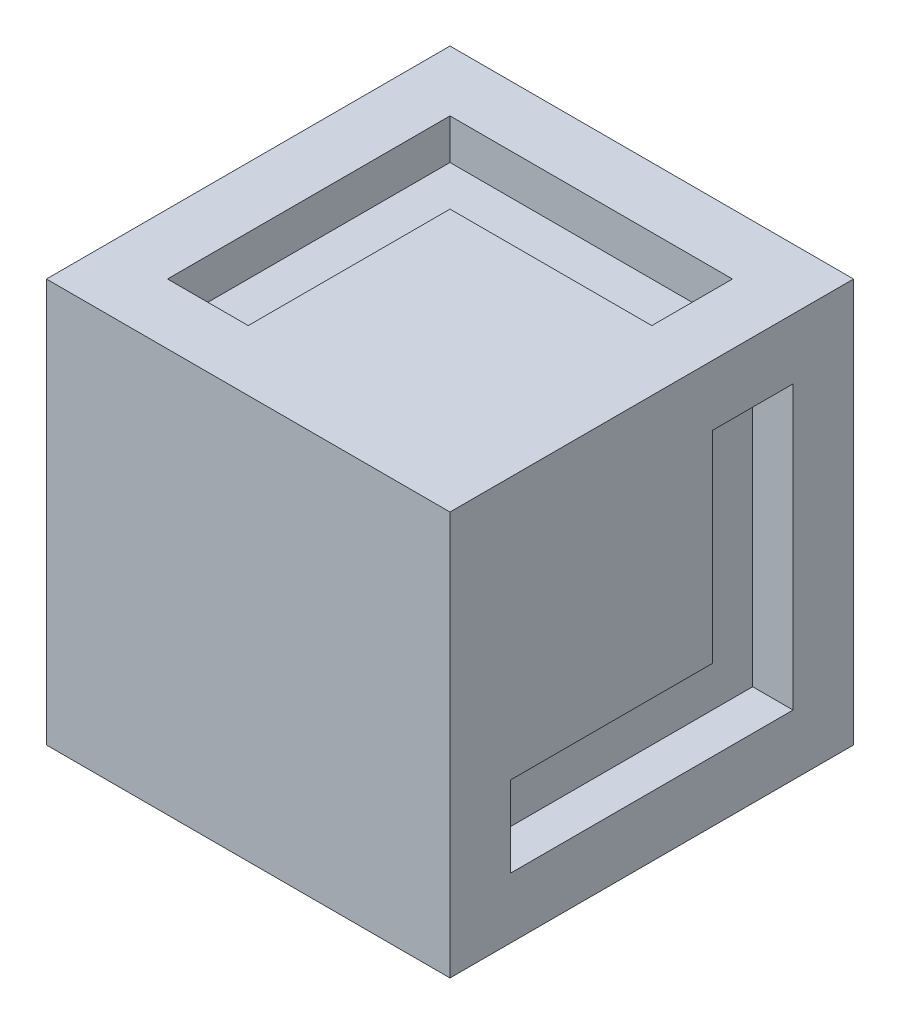
ISO-10303-21;
HEADER;
FILE_DESCRIPTION(('STEP AP214'),'2;1');
FILE_NAME('part.step','',(''),(''),'','','');
FILE_SCHEMA(('AUTOMOTIVE_DESIGN { 1 0 10303 214 1 1 1 1 }'));
ENDSEC;
DATA;
#1=APPLICATION_CONTEXT('core data for automotive mechanical design processes');
#2=APPLICATION_PROTOCOL_DEFINITION('international standard','automotive_design',2000,#1);
#3=PRODUCT_CONTEXT('',#1,'mechanical');
#4=PRODUCT('Part','Part','',(#3));
#5=PRODUCT_RELATED_PRODUCT_CATEGORY('part','',(#4));
#6=PRODUCT_DEFINITION_FORMATION('','',#4);
#7=PRODUCT_DEFINITION_CONTEXT('part definition',#1,'design');
#8=PRODUCT_DEFINITION('design','',#6,#7);
#9=PRODUCT_DEFINITION_SHAPE('','',#8);
#10=(LENGTH_UNIT() NAMED_UNIT(*) SI_UNIT(.MILLI.,.METRE.));
#11=(NAMED_UNIT(*) PLANE_ANGLE_UNIT() SI_UNIT($,.RADIAN.));
#12=(NAMED_UNIT(*) SI_UNIT($,.STERADIAN.) SOLID_ANGLE_UNIT());
#13=UNCERTAINTY_MEASURE_WITH_UNIT(LENGTH_MEASURE(1.E-05),#10,'distance_accuracy_value','');
#14=(GEOMETRIC_REPRESENTATION_CONTEXT(3) GLOBAL_UNCERTAINTY_ASSIGNED_CONTEXT((#13)) GLOBAL_UNIT_ASSIGNED_CONTEXT((#10,
#11,#12)) REPRESENTATION_CONTEXT('',''));
#15=CARTESIAN_POINT('',(0.,0.,0.));
#16=DIRECTION('',(0.,0.,1.));
#17=DIRECTION('',(1.,0.,0.));
#18=AXIS2_PLACEMENT_3D('',#15,#16,#17);
#19=CARTESIAN_POINT('',(10.,15.,25.));
#20=DIRECTION('',(1.,0.,0.));
#21=DIRECTION('',(0.,0.,-1.));
#22=AXIS2_PLACEMENT_3D('',#19,#20,#21);
#23=PLANE('',#22);
#24=DIRECTION('',(0.,1.,0.));
#25=VECTOR('',#24,1.);
#26=CARTESIAN_POINT('',(10.,22.,22.));
#27=LINE('',#26,#25);
#28=CARTESIAN_POINT('',(10.,18.,22.));
#29=VERTEX_POINT('',#28);
#30=CARTESIAN_POINT('',(10.,22.,22.));
#31=VERTEX_POINT('',#30);
#32=EDGE_CURVE('E425',#29,#31,#27,.T.);
#33=ORIENTED_EDGE('',*,*,#32,.F.);
#34=DIRECTION('',(0.,0.,1.));
#35=VECTOR('',#34,1.);
#36=CARTESIAN_POINT('',(10.,18.,22.));
#37=LINE('',#36,#35);
#38=CARTESIAN_POINT('',(10.,18.,8.));
#39=VERTEX_POINT('',#38);
#40=EDGE_CURVE('E393',#39,#29,#37,.T.);
#41=ORIENTED_EDGE('',*,*,#40,.F.);
#42=DIRECTION('',(0.,-1.,0.));
#43=VECTOR('',#42,1.);
#44=CARTESIAN_POINT('',(10.,18.,8.));
#45=LINE('',#44,#43);
#46=CARTESIAN_POINT('',(10.,32.,8.));
#47=VERTEX_POINT('',#46);
#48=EDGE_CURVE('E408',#47,#39,#45,.T.);
#49=ORIENTED_EDGE('',*,*,#48,.F.);
#50=DIRECTION('',(0.,0.,-1.));
#51=VECTOR('',#50,1.);
#52=CARTESIAN_POINT('',(10.,32.,8.));
#53=LINE('',#52,#51);
#54=CARTESIAN_POINT('',(10.,32.,12.));
#55=VERTEX_POINT('',#54);
#56=EDGE_CURVE('E434',#55,#47,#53,.T.);
#57=ORIENTED_EDGE('',*,*,#56,.F.);
#58=DIRECTION('',(0.,1.,0.));
#59=VECTOR('',#58,1.);
#60=CARTESIAN_POINT('',(10.,32.,12.));
#61=LINE('',#60,#59);
#62=CARTESIAN_POINT('',(10.,22.,12.));
#63=VERTEX_POINT('',#62);
#64=EDGE_CURVE('E431',#63,#55,#61,.T.);
#65=ORIENTED_EDGE('',*,*,#64,.F.);
#66=DIRECTION('',(0.,0.,-1.));
#67=VECTOR('',#66,1.);
#68=CARTESIAN_POINT('',(10.,22.,12.));
#69=LINE('',#68,#67);
#70=EDGE_CURVE('E428',#31,#63,#69,.T.);
#71=ORIENTED_EDGE('',*,*,#70,.F.);
#72=EDGE_LOOP('',(#33,#41,#49,#57,#65,#71));
#73=FACE_BOUND('',#72,.T.);
#74=DIRECTION('',(0.,-1.,0.));
#75=VECTOR('',#74,1.);
#76=CARTESIAN_POINT('',(10.,15.,5.));
#77=LINE('',#76,#75);
#78=CARTESIAN_POINT('',(10.,35.,5.));
#79=VERTEX_POINT('',#78);
#80=CARTESIAN_POINT('',(10.,15.,5.));
#81=VERTEX_POINT('',#80);
#82=EDGE_CURVE('E489',#79,#81,#77,.T.);
#83=ORIENTED_EDGE('',*,*,#82,.T.);
#84=DIRECTION('',(0.,0.,-1.));
#85=VECTOR('',#84,1.);
#86=CARTESIAN_POINT('',(10.,15.,25.));
#87=LINE('',#86,#85);
#88=CARTESIAN_POINT('',(10.,15.,25.));
#89=VERTEX_POINT('',#88);
#90=EDGE_CURVE('E11',#89,#81,#87,.T.);
#91=ORIENTED_EDGE('',*,*,#90,.F.);
#92=DIRECTION('',(0.,-1.,0.));
#93=VECTOR('',#92,1.);
#94=CARTESIAN_POINT('',(10.,15.,25.));
#95=LINE('',#94,#93);
#96=CARTESIAN_POINT('',(10.,35.,25.));
#97=VERTEX_POINT('',#96);
#98=EDGE_CURVE('E500',#97,#89,#95,.T.);
#99=ORIENTED_EDGE('',*,*,#98,.F.);
#100=DIRECTION('',(0.,0.,-1.));
#101=VECTOR('',#100,1.);
#102=CARTESIAN_POINT('',(10.,35.,25.));
#103=LINE('',#102,#101);
#104=EDGE_CURVE('E510',#97,#79,#103,.T.);
#105=ORIENTED_EDGE('',*,*,#104,.T.);
#106=EDGE_LOOP('',(#83,#91,#99,#105));
#107=FACE_BOUND('',#106,.T.);
#108=ADVANCED_FACE('F35',(#73,#107),#23,.F.);
#109=CARTESIAN_POINT('',(10.,15.,25.));
#110=DIRECTION('',(0.,1.,0.));
#111=DIRECTION('',(0.,0.,1.));
#112=AXIS2_PLACEMENT_3D('',#109,#110,#111);
#113=PLANE('',#112);
#114=DIRECTION('',(1.,0.,0.));
#115=VECTOR('',#114,1.);
#116=CARTESIAN_POINT('',(13.,15.,8.));
#117=LINE('',#116,#115);
#118=CARTESIAN_POINT('',(13.,15.,8.));
#119=VERTEX_POINT('',#118);
#120=CARTESIAN_POINT('',(27.,15.,8.));
#121=VERTEX_POINT('',#120);
#122=EDGE_CURVE('E330',#119,#121,#117,.T.);
#123=ORIENTED_EDGE('',*,*,#122,.F.);
#124=DIRECTION('',(0.,0.,-1.));
#125=VECTOR('',#124,1.);
#126=CARTESIAN_POINT('',(13.,15.,22.));
#127=LINE('',#126,#125);
#128=CARTESIAN_POINT('',(13.,15.,22.));
#129=VERTEX_POINT('',#128);
#130=EDGE_CURVE('E57',#129,#119,#127,.T.);
#131=ORIENTED_EDGE('',*,*,#130,.F.);
#132=DIRECTION('',(-1.,0.,0.));
#133=VECTOR('',#132,1.);
#134=CARTESIAN_POINT('',(17.,15.,22.));
#135=LINE('',#134,#133);
#136=CARTESIAN_POINT('',(17.,15.,22.));
#137=VERTEX_POINT('',#136);
#138=EDGE_CURVE('E313',#137,#129,#135,.T.);
#139=ORIENTED_EDGE('',*,*,#138,.F.);
#140=DIRECTION('',(0.,0.,1.));
#141=VECTOR('',#140,1.);
#142=CARTESIAN_POINT('',(17.,15.,12.));
#143=LINE('',#142,#141);
#144=CARTESIAN_POINT('',(17.,15.,12.));
#145=VERTEX_POINT('',#144);
#146=EDGE_CURVE('E339',#145,#137,#143,.T.);
#147=ORIENTED_EDGE('',*,*,#146,.F.);
#148=DIRECTION('',(-1.,0.,0.));
#149=VECTOR('',#148,1.);
#150=CARTESIAN_POINT('',(27.,15.,12.));
#151=LINE('',#150,#149);
#152=CARTESIAN_POINT('',(27.,15.,12.));
#153=VERTEX_POINT('',#152);
#154=EDGE_CURVE('E336',#153,#145,#151,.T.);
#155=ORIENTED_EDGE('',*,*,#154,.F.);
#156=DIRECTION('',(0.,0.,1.));
#157=VECTOR('',#156,1.);
#158=CARTESIAN_POINT('',(27.,15.,8.));
#159=LINE('',#158,#157);
#160=EDGE_CURVE('E333',#121,#153,#159,.T.);
#161=ORIENTED_EDGE('',*,*,#160,.F.);
#162=EDGE_LOOP('',(#123,#131,#139,#147,#155,#161));
#163=FACE_BOUND('',#162,.T.);
#164=DIRECTION('',(1.,0.,0.));
#165=VECTOR('',#164,1.);
#166=CARTESIAN_POINT('',(10.,15.,5.));
#167=LINE('',#166,#165);
#168=CARTESIAN_POINT('',(30.,15.,5.));
#169=VERTEX_POINT('',#168);
#170=EDGE_CURVE('E513',#81,#169,#167,.T.);
#171=ORIENTED_EDGE('',*,*,#170,.T.);
#172=DIRECTION('',(0.,0.,-1.));
#173=VECTOR('',#172,1.);
#174=CARTESIAN_POINT('',(30.,15.,25.));
#175=LINE('',#174,#173);
#176=CARTESIAN_POINT('',(30.,15.,25.));
#177=VERTEX_POINT('',#176);
#178=EDGE_CURVE('E42',#177,#169,#175,.T.);
#179=ORIENTED_EDGE('',*,*,#178,.F.);
#180=DIRECTION('',(1.,0.,0.));
#181=VECTOR('',#180,1.);
#182=CARTESIAN_POINT('',(10.,15.,25.));
#183=LINE('',#182,#181);
#184=EDGE_CURVE('E503',#89,#177,#183,.T.);
#185=ORIENTED_EDGE('',*,*,#184,.F.);
#186=ORIENTED_EDGE('',*,*,#90,.T.);
#187=EDGE_LOOP('',(#171,#179,#185,#186));
#188=FACE_BOUND('',#187,.T.);
#189=ADVANCED_FACE('F543',(#163,#188),#113,.F.);
#190=CARTESIAN_POINT('',(30.,15.,25.));
#191=DIRECTION('',(-1.,0.,0.));
#192=DIRECTION('',(0.,0.,1.));
#193=AXIS2_PLACEMENT_3D('',#190,#191,#192);
#194=PLANE('',#193);
#195=DIRECTION('',(0.,1.,0.));
#196=VECTOR('',#195,1.);
#197=CARTESIAN_POINT('',(30.,18.,8.));
#198=LINE('',#197,#196);
#199=CARTESIAN_POINT('',(30.,18.,8.));
#200=VERTEX_POINT('',#199);
#201=CARTESIAN_POINT('',(30.,32.,8.));
#202=VERTEX_POINT('',#201);
#203=EDGE_CURVE('E473',#200,#202,#198,.T.);
#204=ORIENTED_EDGE('',*,*,#203,.F.);
#205=DIRECTION('',(0.,0.,-1.));
#206=VECTOR('',#205,1.);
#207=CARTESIAN_POINT('',(30.,18.,22.));
#208=LINE('',#207,#206);
#209=CARTESIAN_POINT('',(30.,18.,22.));
#210=VERTEX_POINT('',#209);
#211=EDGE_CURVE('E441',#210,#200,#208,.T.);
#212=ORIENTED_EDGE('',*,*,#211,.F.);
#213=DIRECTION('',(0.,-1.,0.));
#214=VECTOR('',#213,1.);
#215=CARTESIAN_POINT('',(30.,22.,22.));
#216=LINE('',#215,#214);
#217=CARTESIAN_POINT('',(30.,22.,22.));
#218=VERTEX_POINT('',#217);
#219=EDGE_CURVE('E456',#218,#210,#216,.T.);
#220=ORIENTED_EDGE('',*,*,#219,.F.);
#221=DIRECTION('',(0.,0.,1.));
#222=VECTOR('',#221,1.);
#223=CARTESIAN_POINT('',(30.,22.,12.));
#224=LINE('',#223,#222);
#225=CARTESIAN_POINT('',(30.,22.,12.));
#226=VERTEX_POINT('',#225);
#227=EDGE_CURVE('E482',#226,#218,#224,.T.);
#228=ORIENTED_EDGE('',*,*,#227,.F.);
#229=DIRECTION('',(0.,-1.,0.));
#230=VECTOR('',#229,1.);
#231=CARTESIAN_POINT('',(30.,32.,12.));
#232=LINE('',#231,#230);
#233=CARTESIAN_POINT('',(30.,32.,12.));
#234=VERTEX_POINT('',#233);
#235=EDGE_CURVE('E479',#234,#226,#232,.T.);
#236=ORIENTED_EDGE('',*,*,#235,.F.);
#237=DIRECTION('',(0.,0.,1.));
#238=VECTOR('',#237,1.);
#239=CARTESIAN_POINT('',(30.,32.,8.));
#240=LINE('',#239,#238);
#241=EDGE_CURVE('E476',#202,#234,#240,.T.);
#242=ORIENTED_EDGE('',*,*,#241,.F.);
#243=EDGE_LOOP('',(#204,#212,#220,#228,#236,#242));
#244=FACE_BOUND('',#243,.T.);
#245=DIRECTION('',(0.,1.,0.));
#246=VECTOR('',#245,1.);
#247=CARTESIAN_POINT('',(30.,15.,5.));
#248=LINE('',#247,#246);
#249=CARTESIAN_POINT('',(30.,35.,5.));
#250=VERTEX_POINT('',#249);
#251=EDGE_CURVE('E515',#169,#250,#248,.T.);
#252=ORIENTED_EDGE('',*,*,#251,.T.);
#253=DIRECTION('',(0.,0.,-1.));
#254=VECTOR('',#253,1.);
#255=CARTESIAN_POINT('',(30.,35.,25.));
#256=LINE('',#255,#254);
#257=CARTESIAN_POINT('',(30.,35.,25.));
#258=VERTEX_POINT('',#257);
#259=EDGE_CURVE('E520',#258,#250,#256,.T.);
#260=ORIENTED_EDGE('',*,*,#259,.F.);
#261=DIRECTION('',(0.,1.,0.));
#262=VECTOR('',#261,1.);
#263=CARTESIAN_POINT('',(30.,15.,25.));
#264=LINE('',#263,#262);
#265=EDGE_CURVE('E506',#177,#258,#264,.T.);
#266=ORIENTED_EDGE('',*,*,#265,.F.);
#267=ORIENTED_EDGE('',*,*,#178,.T.);
#268=EDGE_LOOP('',(#252,#260,#266,#267));
#269=FACE_BOUND('',#268,.T.);
#270=ADVANCED_FACE('F527',(#244,#269),#194,.F.);
#271=CARTESIAN_POINT('',(10.,35.,25.));
#272=DIRECTION('',(0.,-1.,0.));
#273=DIRECTION('',(0.,0.,-1.));
#274=AXIS2_PLACEMENT_3D('',#271,#272,#273);
#275=PLANE('',#274);
#276=DIRECTION('',(1.,0.,0.));
#277=VECTOR('',#276,1.);
#278=CARTESIAN_POINT('',(17.,35.,22.));
#279=LINE('',#278,#277);
#280=CARTESIAN_POINT('',(13.,35.,22.));
#281=VERTEX_POINT('',#280);
#282=CARTESIAN_POINT('',(17.,35.,22.));
#283=VERTEX_POINT('',#282);
#284=EDGE_CURVE('E377',#281,#283,#279,.T.);
#285=ORIENTED_EDGE('',*,*,#284,.F.);
#286=DIRECTION('',(0.,0.,1.));
#287=VECTOR('',#286,1.);
#288=CARTESIAN_POINT('',(13.,35.,22.));
#289=LINE('',#288,#287);
#290=CARTESIAN_POINT('',(13.,35.,8.));
#291=VERTEX_POINT('',#290);
#292=EDGE_CURVE('E346',#291,#281,#289,.T.);
#293=ORIENTED_EDGE('',*,*,#292,.F.);
#294=DIRECTION('',(-1.,0.,0.));
#295=VECTOR('',#294,1.);
#296=CARTESIAN_POINT('',(13.,35.,8.));
#297=LINE('',#296,#295);
#298=CARTESIAN_POINT('',(27.,35.,8.));
#299=VERTEX_POINT('',#298);
#300=EDGE_CURVE('E360',#299,#291,#297,.T.);
#301=ORIENTED_EDGE('',*,*,#300,.F.);
#302=DIRECTION('',(0.,0.,-1.));
#303=VECTOR('',#302,1.);
#304=CARTESIAN_POINT('',(27.,35.,8.));
#305=LINE('',#304,#303);
#306=CARTESIAN_POINT('',(27.,35.,12.));
#307=VERTEX_POINT('',#306);
#308=EDGE_CURVE('E386',#307,#299,#305,.T.);
#309=ORIENTED_EDGE('',*,*,#308,.F.);
#310=DIRECTION('',(1.,0.,0.));
#311=VECTOR('',#310,1.);
#312=CARTESIAN_POINT('',(27.,35.,12.));
#313=LINE('',#312,#311);
#314=CARTESIAN_POINT('',(17.,35.,12.));
#315=VERTEX_POINT('',#314);
#316=EDGE_CURVE('E383',#315,#307,#313,.T.);
#317=ORIENTED_EDGE('',*,*,#316,.F.);
#318=DIRECTION('',(0.,0.,-1.));
#319=VECTOR('',#318,1.);
#320=CARTESIAN_POINT('',(17.,35.,12.));
#321=LINE('',#320,#319);
#322=EDGE_CURVE('E380',#283,#315,#321,.T.);
#323=ORIENTED_EDGE('',*,*,#322,.F.);
#324=EDGE_LOOP('',(#285,#293,#301,#309,#317,#323));
#325=FACE_BOUND('',#324,.T.);
#326=DIRECTION('',(-1.,0.,0.));
#327=VECTOR('',#326,1.);
#328=CARTESIAN_POINT('',(10.,35.,5.));
#329=LINE('',#328,#327);
#330=EDGE_CURVE('E504',#250,#79,#329,.T.);
#331=ORIENTED_EDGE('',*,*,#330,.T.);
#332=ORIENTED_EDGE('',*,*,#104,.F.);
#333=DIRECTION('',(-1.,0.,0.));
#334=VECTOR('',#333,1.);
#335=CARTESIAN_POINT('',(10.,35.,25.));
#336=LINE('',#335,#334);
#337=EDGE_CURVE('E508',#258,#97,#336,.T.);
#338=ORIENTED_EDGE('',*,*,#337,.F.);
#339=ORIENTED_EDGE('',*,*,#259,.T.);
#340=EDGE_LOOP('',(#331,#332,#338,#339));
#341=FACE_BOUND('',#340,.T.);
#342=ADVANCED_FACE('F536',(#325,#341),#275,.F.);
#343=CARTESIAN_POINT('',(0.,0.,25.));
#344=DIRECTION('',(0.,0.,-1.));
#345=DIRECTION('',(-1.,0.,0.));
#346=AXIS2_PLACEMENT_3D('',#343,#344,#345);
#347=PLANE('',#346);
#348=ORIENTED_EDGE('',*,*,#98,.T.);
#349=ORIENTED_EDGE('',*,*,#184,.T.);
#350=ORIENTED_EDGE('',*,*,#265,.T.);
#351=ORIENTED_EDGE('',*,*,#337,.T.);
#352=EDGE_LOOP('',(#348,#349,#350,#351));
#353=FACE_BOUND('',#352,.T.);
#354=ADVANCED_FACE('F542',(#353),#347,.F.);
#355=CARTESIAN_POINT('',(0.,0.,5.));
#356=DIRECTION('',(0.,0.,-1.));
#357=DIRECTION('',(-1.,0.,0.));
#358=AXIS2_PLACEMENT_3D('',#355,#356,#357);
#359=PLANE('',#358);
#360=DIRECTION('',(0.,1.,0.));
#361=VECTOR('',#360,1.);
#362=CARTESIAN_POINT('',(13.,32.,5.));
#363=LINE('',#362,#361);
#364=CARTESIAN_POINT('',(13.,18.,5.));
#365=VERTEX_POINT('',#364);
#366=CARTESIAN_POINT('',(13.,32.,5.));
#367=VERTEX_POINT('',#366);
#368=EDGE_CURVE('E49',#365,#367,#363,.T.);
#369=ORIENTED_EDGE('',*,*,#368,.F.);
#370=DIRECTION('',(-1.,0.,0.));
#371=VECTOR('',#370,1.);
#372=CARTESIAN_POINT('',(13.,18.,5.));
#373=LINE('',#372,#371);
#374=CARTESIAN_POINT('',(27.,18.,5.));
#375=VERTEX_POINT('',#374);
#376=EDGE_CURVE('E276',#375,#365,#373,.T.);
#377=ORIENTED_EDGE('',*,*,#376,.F.);
#378=DIRECTION('',(0.,-1.,0.));
#379=VECTOR('',#378,1.);
#380=CARTESIAN_POINT('',(27.,18.,5.));
#381=LINE('',#380,#379);
#382=CARTESIAN_POINT('',(27.,22.,5.));
#383=VERTEX_POINT('',#382);
#384=EDGE_CURVE('E279',#383,#375,#381,.T.);
#385=ORIENTED_EDGE('',*,*,#384,.F.);
#386=DIRECTION('',(1.,0.,0.));
#387=VECTOR('',#386,1.);
#388=CARTESIAN_POINT('',(27.,22.,5.));
#389=LINE('',#388,#387);
#390=CARTESIAN_POINT('',(17.,22.,5.));
#391=VERTEX_POINT('',#390);
#392=EDGE_CURVE('E295',#391,#383,#389,.T.);
#393=ORIENTED_EDGE('',*,*,#392,.F.);
#394=DIRECTION('',(0.,-1.,0.));
#395=VECTOR('',#394,1.);
#396=CARTESIAN_POINT('',(17.,22.,5.));
#397=LINE('',#396,#395);
#398=CARTESIAN_POINT('',(17.,32.,5.));
#399=VERTEX_POINT('',#398);
#400=EDGE_CURVE('E292',#399,#391,#397,.T.);
#401=ORIENTED_EDGE('',*,*,#400,.F.);
#402=DIRECTION('',(1.,0.,0.));
#403=VECTOR('',#402,1.);
#404=CARTESIAN_POINT('',(17.,32.,5.));
#405=LINE('',#404,#403);
#406=EDGE_CURVE('E290',#367,#399,#405,.T.);
#407=ORIENTED_EDGE('',*,*,#406,.F.);
#408=EDGE_LOOP('',(#369,#377,#385,#393,#401,#407));
#409=FACE_BOUND('',#408,.T.);
#410=ORIENTED_EDGE('',*,*,#82,.F.);
#411=ORIENTED_EDGE('',*,*,#330,.F.);
#412=ORIENTED_EDGE('',*,*,#251,.F.);
#413=ORIENTED_EDGE('',*,*,#170,.F.);
#414=EDGE_LOOP('',(#410,#411,#412,#413));
#415=FACE_BOUND('',#414,.T.);
#416=ADVANCED_FACE('F533',(#409,#415),#359,.T.);
#417=CARTESIAN_POINT('',(28.,18.,22.));
#418=DIRECTION('',(0.,-1.,0.));
#419=DIRECTION('',(0.,0.,-1.));
#420=AXIS2_PLACEMENT_3D('',#417,#418,#419);
#421=PLANE('',#420);
#422=ORIENTED_EDGE('',*,*,#211,.T.);
#423=DIRECTION('',(1.,0.,0.));
#424=VECTOR('',#423,1.);
#425=CARTESIAN_POINT('',(28.,18.,8.));
#426=LINE('',#425,#424);
#427=CARTESIAN_POINT('',(28.,18.,8.));
#428=VERTEX_POINT('',#427);
#429=EDGE_CURVE('E471',#428,#200,#426,.T.);
#430=ORIENTED_EDGE('',*,*,#429,.F.);
#431=DIRECTION('',(0.,0.,-1.));
#432=VECTOR('',#431,1.);
#433=CARTESIAN_POINT('',(28.,18.,22.));
#434=LINE('',#433,#432);
#435=CARTESIAN_POINT('',(28.,18.,22.));
#436=VERTEX_POINT('',#435);
#437=EDGE_CURVE('E452',#436,#428,#434,.T.);
#438=ORIENTED_EDGE('',*,*,#437,.F.);
#439=DIRECTION('',(1.,0.,0.));
#440=VECTOR('',#439,1.);
#441=CARTESIAN_POINT('',(28.,18.,22.));
#442=LINE('',#441,#440);
#443=EDGE_CURVE('E487',#436,#210,#442,.T.);
#444=ORIENTED_EDGE('',*,*,#443,.T.);
#445=EDGE_LOOP('',(#422,#430,#438,#444));
#446=FACE_BOUND('',#445,.T.);
#447=ADVANCED_FACE('F560',(#446),#421,.F.);
#448=CARTESIAN_POINT('',(28.,22.,22.));
#449=DIRECTION('',(0.,0.,1.));
#450=DIRECTION('',(1.,0.,0.));
#451=AXIS2_PLACEMENT_3D('',#448,#449,#450);
#452=PLANE('',#451);
#453=ORIENTED_EDGE('',*,*,#219,.T.);
#454=ORIENTED_EDGE('',*,*,#443,.F.);
#455=DIRECTION('',(0.,-1.,0.));
#456=VECTOR('',#455,1.);
#457=CARTESIAN_POINT('',(28.,22.,22.));
#458=LINE('',#457,#456);
#459=CARTESIAN_POINT('',(28.,22.,22.));
#460=VERTEX_POINT('',#459);
#461=EDGE_CURVE('E468',#460,#436,#458,.T.);
#462=ORIENTED_EDGE('',*,*,#461,.F.);
#463=DIRECTION('',(1.,0.,0.));
#464=VECTOR('',#463,1.);
#465=CARTESIAN_POINT('',(28.,22.,22.));
#466=LINE('',#465,#464);
#467=EDGE_CURVE('E490',#460,#218,#466,.T.);
#468=ORIENTED_EDGE('',*,*,#467,.T.);
#469=EDGE_LOOP('',(#453,#454,#462,#468));
#470=FACE_BOUND('',#469,.T.);
#471=ADVANCED_FACE('F566',(#470),#452,.F.);
#472=CARTESIAN_POINT('',(28.,22.,12.));
#473=DIRECTION('',(0.,1.,0.));
#474=DIRECTION('',(0.,0.,1.));
#475=AXIS2_PLACEMENT_3D('',#472,#473,#474);
#476=PLANE('',#475);
#477=ORIENTED_EDGE('',*,*,#227,.T.);
#478=ORIENTED_EDGE('',*,*,#467,.F.);
#479=DIRECTION('',(0.,0.,1.));
#480=VECTOR('',#479,1.);
#481=CARTESIAN_POINT('',(28.,22.,12.));
#482=LINE('',#481,#480);
#483=CARTESIAN_POINT('',(28.,22.,12.));
#484=VERTEX_POINT('',#483);
#485=EDGE_CURVE('E465',#484,#460,#482,.T.);
#486=ORIENTED_EDGE('',*,*,#485,.F.);
#487=DIRECTION('',(1.,0.,0.));
#488=VECTOR('',#487,1.);
#489=CARTESIAN_POINT('',(28.,22.,12.));
#490=LINE('',#489,#488);
#491=EDGE_CURVE('E492',#484,#226,#490,.T.);
#492=ORIENTED_EDGE('',*,*,#491,.T.);
#493=EDGE_LOOP('',(#477,#478,#486,#492));
#494=FACE_BOUND('',#493,.T.);
#495=ADVANCED_FACE('F580',(#494),#476,.F.);
#496=CARTESIAN_POINT('',(28.,32.,12.));
#497=DIRECTION('',(0.,0.,1.));
#498=DIRECTION('',(1.,0.,0.));
#499=AXIS2_PLACEMENT_3D('',#496,#497,#498);
#500=PLANE('',#499);
#501=ORIENTED_EDGE('',*,*,#235,.T.);
#502=ORIENTED_EDGE('',*,*,#491,.F.);
#503=DIRECTION('',(0.,-1.,0.));
#504=VECTOR('',#503,1.);
#505=CARTESIAN_POINT('',(28.,32.,12.));
#506=LINE('',#505,#504);
#507=CARTESIAN_POINT('',(28.,32.,12.));
#508=VERTEX_POINT('',#507);
#509=EDGE_CURVE('E462',#508,#484,#506,.T.);
#510=ORIENTED_EDGE('',*,*,#509,.F.);
#511=DIRECTION('',(1.,0.,0.));
#512=VECTOR('',#511,1.);
#513=CARTESIAN_POINT('',(28.,32.,12.));
#514=LINE('',#513,#512);
#515=EDGE_CURVE('E494',#508,#234,#514,.T.);
#516=ORIENTED_EDGE('',*,*,#515,.T.);
#517=EDGE_LOOP('',(#501,#502,#510,#516));
#518=FACE_BOUND('',#517,.T.);
#519=ADVANCED_FACE('F576',(#518),#500,.F.);
#520=CARTESIAN_POINT('',(28.,32.,8.));
#521=DIRECTION('',(0.,1.,0.));
#522=DIRECTION('',(0.,0.,1.));
#523=AXIS2_PLACEMENT_3D('',#520,#521,#522);
#524=PLANE('',#523);
#525=ORIENTED_EDGE('',*,*,#241,.T.);
#526=ORIENTED_EDGE('',*,*,#515,.F.);
#527=DIRECTION('',(0.,0.,1.));
#528=VECTOR('',#527,1.);
#529=CARTESIAN_POINT('',(28.,32.,8.));
#530=LINE('',#529,#528);
#531=CARTESIAN_POINT('',(28.,32.,8.));
#532=VERTEX_POINT('',#531);
#533=EDGE_CURVE('E459',#532,#508,#530,.T.);
#534=ORIENTED_EDGE('',*,*,#533,.F.);
#535=DIRECTION('',(1.,0.,0.));
#536=VECTOR('',#535,1.);
#537=CARTESIAN_POINT('',(28.,32.,8.));
#538=LINE('',#537,#536);
#539=EDGE_CURVE('E496',#532,#202,#538,.T.);
#540=ORIENTED_EDGE('',*,*,#539,.T.);
#541=EDGE_LOOP('',(#525,#526,#534,#540));
#542=FACE_BOUND('',#541,.T.);
#543=ADVANCED_FACE('F572',(#542),#524,.F.);
#544=CARTESIAN_POINT('',(28.,18.,8.));
#545=DIRECTION('',(0.,0.,-1.));
#546=DIRECTION('',(-1.,0.,0.));
#547=AXIS2_PLACEMENT_3D('',#544,#545,#546);
#548=PLANE('',#547);
#549=ORIENTED_EDGE('',*,*,#203,.T.);
#550=ORIENTED_EDGE('',*,*,#539,.F.);
#551=DIRECTION('',(0.,1.,0.));
#552=VECTOR('',#551,1.);
#553=CARTESIAN_POINT('',(28.,18.,8.));
#554=LINE('',#553,#552);
#555=EDGE_CURVE('E455',#428,#532,#554,.T.);
#556=ORIENTED_EDGE('',*,*,#555,.F.);
#557=ORIENTED_EDGE('',*,*,#429,.T.);
#558=EDGE_LOOP('',(#549,#550,#556,#557));
#559=FACE_BOUND('',#558,.T.);
#560=ADVANCED_FACE('F568',(#559),#548,.F.);
#561=CARTESIAN_POINT('',(28.,0.,0.));
#562=DIRECTION('',(1.,0.,0.));
#563=DIRECTION('',(0.,0.,-1.));
#564=AXIS2_PLACEMENT_3D('',#561,#562,#563);
#565=PLANE('',#564);
#566=ORIENTED_EDGE('',*,*,#437,.T.);
#567=ORIENTED_EDGE('',*,*,#555,.T.);
#568=ORIENTED_EDGE('',*,*,#533,.T.);
#569=ORIENTED_EDGE('',*,*,#509,.T.);
#570=ORIENTED_EDGE('',*,*,#485,.T.);
#571=ORIENTED_EDGE('',*,*,#461,.T.);
#572=EDGE_LOOP('',(#566,#567,#568,#569,#570,#571));
#573=FACE_BOUND('',#572,.T.);
#574=ADVANCED_FACE('F571',(#573),#565,.T.);
#575=CARTESIAN_POINT('',(12.,18.,22.));
#576=DIRECTION('',(0.,-1.,0.));
#577=DIRECTION('',(0.,0.,-1.));
#578=AXIS2_PLACEMENT_3D('',#575,#576,#577);
#579=PLANE('',#578);
#580=ORIENTED_EDGE('',*,*,#40,.T.);
#581=DIRECTION('',(-1.,0.,0.));
#582=VECTOR('',#581,1.);
#583=CARTESIAN_POINT('',(12.,18.,22.));
#584=LINE('',#583,#582);
#585=CARTESIAN_POINT('',(12.,18.,22.));
#586=VERTEX_POINT('',#585);
#587=EDGE_CURVE('E423',#586,#29,#584,.T.);
#588=ORIENTED_EDGE('',*,*,#587,.F.);
#589=DIRECTION('',(0.,0.,1.));
#590=VECTOR('',#589,1.);
#591=CARTESIAN_POINT('',(12.,18.,22.));
#592=LINE('',#591,#590);
#593=CARTESIAN_POINT('',(12.,18.,8.));
#594=VERTEX_POINT('',#593);
#595=EDGE_CURVE('E404',#594,#586,#592,.T.);
#596=ORIENTED_EDGE('',*,*,#595,.F.);
#597=DIRECTION('',(-1.,0.,0.));
#598=VECTOR('',#597,1.);
#599=CARTESIAN_POINT('',(12.,18.,8.));
#600=LINE('',#599,#598);
#601=EDGE_CURVE('E439',#594,#39,#600,.T.);
#602=ORIENTED_EDGE('',*,*,#601,.T.);
#603=EDGE_LOOP('',(#580,#588,#596,#602));
#604=FACE_BOUND('',#603,.T.);
#605=ADVANCED_FACE('F590',(#604),#579,.F.);
#606=CARTESIAN_POINT('',(12.,18.,8.));
#607=DIRECTION('',(0.,0.,-1.));
#608=DIRECTION('',(-1.,0.,0.));
#609=AXIS2_PLACEMENT_3D('',#606,#607,#608);
#610=PLANE('',#609);
#611=ORIENTED_EDGE('',*,*,#48,.T.);
#612=ORIENTED_EDGE('',*,*,#601,.F.);
#613=DIRECTION('',(0.,-1.,0.));
#614=VECTOR('',#613,1.);
#615=CARTESIAN_POINT('',(12.,18.,8.));
#616=LINE('',#615,#614);
#617=CARTESIAN_POINT('',(12.,32.,8.));
#618=VERTEX_POINT('',#617);
#619=EDGE_CURVE('E420',#618,#594,#616,.T.);
#620=ORIENTED_EDGE('',*,*,#619,.F.);
#621=DIRECTION('',(-1.,0.,0.));
#622=VECTOR('',#621,1.);
#623=CARTESIAN_POINT('',(12.,32.,8.));
#624=LINE('',#623,#622);
#625=EDGE_CURVE('E442',#618,#47,#624,.T.);
#626=ORIENTED_EDGE('',*,*,#625,.T.);
#627=EDGE_LOOP('',(#611,#612,#620,#626));
#628=FACE_BOUND('',#627,.T.);
#629=ADVANCED_FACE('F594',(#628),#610,.F.);
#630=CARTESIAN_POINT('',(12.,32.,8.));
#631=DIRECTION('',(0.,1.,0.));
#632=DIRECTION('',(0.,0.,1.));
#633=AXIS2_PLACEMENT_3D('',#630,#631,#632);
#634=PLANE('',#633);
#635=ORIENTED_EDGE('',*,*,#56,.T.);
#636=ORIENTED_EDGE('',*,*,#625,.F.);
#637=DIRECTION('',(0.,0.,-1.));
#638=VECTOR('',#637,1.);
#639=CARTESIAN_POINT('',(12.,32.,8.));
#640=LINE('',#639,#638);
#641=CARTESIAN_POINT('',(12.,32.,12.));
#642=VERTEX_POINT('',#641);
#643=EDGE_CURVE('E417',#642,#618,#640,.T.);
#644=ORIENTED_EDGE('',*,*,#643,.F.);
#645=DIRECTION('',(-1.,0.,0.));
#646=VECTOR('',#645,1.);
#647=CARTESIAN_POINT('',(12.,32.,12.));
#648=LINE('',#647,#646);
#649=EDGE_CURVE('E444',#642,#55,#648,.T.);
#650=ORIENTED_EDGE('',*,*,#649,.T.);
#651=EDGE_LOOP('',(#635,#636,#644,#650));
#652=FACE_BOUND('',#651,.T.);
#653=ADVANCED_FACE('F608',(#652),#634,.F.);
#654=CARTESIAN_POINT('',(12.,32.,12.));
#655=DIRECTION('',(0.,0.,1.));
#656=DIRECTION('',(1.,0.,0.));
#657=AXIS2_PLACEMENT_3D('',#654,#655,#656);
#658=PLANE('',#657);
#659=ORIENTED_EDGE('',*,*,#64,.T.);
#660=ORIENTED_EDGE('',*,*,#649,.F.);
#661=DIRECTION('',(0.,1.,0.));
#662=VECTOR('',#661,1.);
#663=CARTESIAN_POINT('',(12.,32.,12.));
#664=LINE('',#663,#662);
#665=CARTESIAN_POINT('',(12.,22.,12.));
#666=VERTEX_POINT('',#665);
#667=EDGE_CURVE('E414',#666,#642,#664,.T.);
#668=ORIENTED_EDGE('',*,*,#667,.F.);
#669=DIRECTION('',(-1.,0.,0.));
#670=VECTOR('',#669,1.);
#671=CARTESIAN_POINT('',(12.,22.,12.));
#672=LINE('',#671,#670);
#673=EDGE_CURVE('E446',#666,#63,#672,.T.);
#674=ORIENTED_EDGE('',*,*,#673,.T.);
#675=EDGE_LOOP('',(#659,#660,#668,#674));
#676=FACE_BOUND('',#675,.T.);
#677=ADVANCED_FACE('F604',(#676),#658,.F.);
#678=CARTESIAN_POINT('',(12.,22.,12.));
#679=DIRECTION('',(0.,1.,0.));
#680=DIRECTION('',(0.,0.,1.));
#681=AXIS2_PLACEMENT_3D('',#678,#679,#680);
#682=PLANE('',#681);
#683=ORIENTED_EDGE('',*,*,#70,.T.);
#684=ORIENTED_EDGE('',*,*,#673,.F.);
#685=DIRECTION('',(0.,0.,-1.));
#686=VECTOR('',#685,1.);
#687=CARTESIAN_POINT('',(12.,22.,12.));
#688=LINE('',#687,#686);
#689=CARTESIAN_POINT('',(12.,22.,22.));
#690=VERTEX_POINT('',#689);
#691=EDGE_CURVE('E411',#690,#666,#688,.T.);
#692=ORIENTED_EDGE('',*,*,#691,.F.);
#693=DIRECTION('',(-1.,0.,0.));
#694=VECTOR('',#693,1.);
#695=CARTESIAN_POINT('',(12.,22.,22.));
#696=LINE('',#695,#694);
#697=EDGE_CURVE('E448',#690,#31,#696,.T.);
#698=ORIENTED_EDGE('',*,*,#697,.T.);
#699=EDGE_LOOP('',(#683,#684,#692,#698));
#700=FACE_BOUND('',#699,.T.);
#701=ADVANCED_FACE('F600',(#700),#682,.F.);
#702=CARTESIAN_POINT('',(12.,22.,22.));
#703=DIRECTION('',(0.,0.,1.));
#704=DIRECTION('',(1.,0.,0.));
#705=AXIS2_PLACEMENT_3D('',#702,#703,#704);
#706=PLANE('',#705);
#707=ORIENTED_EDGE('',*,*,#32,.T.);
#708=ORIENTED_EDGE('',*,*,#697,.F.);
#709=DIRECTION('',(0.,1.,0.));
#710=VECTOR('',#709,1.);
#711=CARTESIAN_POINT('',(12.,22.,22.));
#712=LINE('',#711,#710);
#713=EDGE_CURVE('E407',#586,#690,#712,.T.);
#714=ORIENTED_EDGE('',*,*,#713,.F.);
#715=ORIENTED_EDGE('',*,*,#587,.T.);
#716=EDGE_LOOP('',(#707,#708,#714,#715));
#717=FACE_BOUND('',#716,.T.);
#718=ADVANCED_FACE('F596',(#717),#706,.F.);
#719=CARTESIAN_POINT('',(12.,0.,0.));
#720=DIRECTION('',(1.,0.,0.));
#721=DIRECTION('',(0.,0.,-1.));
#722=AXIS2_PLACEMENT_3D('',#719,#720,#721);
#723=PLANE('',#722);
#724=ORIENTED_EDGE('',*,*,#595,.T.);
#725=ORIENTED_EDGE('',*,*,#713,.T.);
#726=ORIENTED_EDGE('',*,*,#691,.T.);
#727=ORIENTED_EDGE('',*,*,#667,.T.);
#728=ORIENTED_EDGE('',*,*,#643,.T.);
#729=ORIENTED_EDGE('',*,*,#619,.T.);
#730=EDGE_LOOP('',(#724,#725,#726,#727,#728,#729));
#731=FACE_BOUND('',#730,.T.);
#732=ADVANCED_FACE('F599',(#731),#723,.F.);
#733=CARTESIAN_POINT('',(13.,33.,22.));
#734=DIRECTION('',(-1.,0.,0.));
#735=DIRECTION('',(0.,0.,1.));
#736=AXIS2_PLACEMENT_3D('',#733,#734,#735);
#737=PLANE('',#736);
#738=ORIENTED_EDGE('',*,*,#292,.T.);
#739=DIRECTION('',(0.,1.,0.));
#740=VECTOR('',#739,1.);
#741=CARTESIAN_POINT('',(13.,33.,22.));
#742=LINE('',#741,#740);
#743=CARTESIAN_POINT('',(13.,33.,22.));
#744=VERTEX_POINT('',#743);
#745=EDGE_CURVE('E375',#744,#281,#742,.T.);
#746=ORIENTED_EDGE('',*,*,#745,.F.);
#747=DIRECTION('',(0.,0.,1.));
#748=VECTOR('',#747,1.);
#749=CARTESIAN_POINT('',(13.,33.,22.));
#750=LINE('',#749,#748);
#751=CARTESIAN_POINT('',(13.,33.,8.));
#752=VERTEX_POINT('',#751);
#753=EDGE_CURVE('E356',#752,#744,#750,.T.);
#754=ORIENTED_EDGE('',*,*,#753,.F.);
#755=DIRECTION('',(0.,1.,0.));
#756=VECTOR('',#755,1.);
#757=CARTESIAN_POINT('',(13.,33.,8.));
#758=LINE('',#757,#756);
#759=EDGE_CURVE('E391',#752,#291,#758,.T.);
#760=ORIENTED_EDGE('',*,*,#759,.T.);
#761=EDGE_LOOP('',(#738,#746,#754,#760));
#762=FACE_BOUND('',#761,.T.);
#763=ADVANCED_FACE('F618',(#762),#737,.F.);
#764=CARTESIAN_POINT('',(13.,33.,8.));
#765=DIRECTION('',(0.,0.,-1.));
#766=DIRECTION('',(-1.,0.,0.));
#767=AXIS2_PLACEMENT_3D('',#764,#765,#766);
#768=PLANE('',#767);
#769=ORIENTED_EDGE('',*,*,#300,.T.);
#770=ORIENTED_EDGE('',*,*,#759,.F.);
#771=DIRECTION('',(-1.,0.,0.));
#772=VECTOR('',#771,1.);
#773=CARTESIAN_POINT('',(13.,33.,8.));
#774=LINE('',#773,#772);
#775=CARTESIAN_POINT('',(27.,33.,8.));
#776=VERTEX_POINT('',#775);
#777=EDGE_CURVE('E372',#776,#752,#774,.T.);
#778=ORIENTED_EDGE('',*,*,#777,.F.);
#779=DIRECTION('',(0.,1.,0.));
#780=VECTOR('',#779,1.);
#781=CARTESIAN_POINT('',(27.,33.,8.));
#782=LINE('',#781,#780);
#783=EDGE_CURVE('E394',#776,#299,#782,.T.);
#784=ORIENTED_EDGE('',*,*,#783,.T.);
#785=EDGE_LOOP('',(#769,#770,#778,#784));
#786=FACE_BOUND('',#785,.T.);
#787=ADVANCED_FACE('F622',(#786),#768,.F.);
#788=CARTESIAN_POINT('',(27.,33.,8.));
#789=DIRECTION('',(1.,0.,0.));
#790=DIRECTION('',(0.,0.,-1.));
#791=AXIS2_PLACEMENT_3D('',#788,#789,#790);
#792=PLANE('',#791);
#793=ORIENTED_EDGE('',*,*,#308,.T.);
#794=ORIENTED_EDGE('',*,*,#783,.F.);
#795=DIRECTION('',(0.,0.,-1.));
#796=VECTOR('',#795,1.);
#797=CARTESIAN_POINT('',(27.,33.,8.));
#798=LINE('',#797,#796);
#799=CARTESIAN_POINT('',(27.,33.,12.));
#800=VERTEX_POINT('',#799);
#801=EDGE_CURVE('E369',#800,#776,#798,.T.);
#802=ORIENTED_EDGE('',*,*,#801,.F.);
#803=DIRECTION('',(0.,1.,0.));
#804=VECTOR('',#803,1.);
#805=CARTESIAN_POINT('',(27.,33.,12.));
#806=LINE('',#805,#804);
#807=EDGE_CURVE('E396',#800,#307,#806,.T.);
#808=ORIENTED_EDGE('',*,*,#807,.T.);
#809=EDGE_LOOP('',(#793,#794,#802,#808));
#810=FACE_BOUND('',#809,.T.);
#811=ADVANCED_FACE('F636',(#810),#792,.F.);
#812=CARTESIAN_POINT('',(27.,33.,12.));
#813=DIRECTION('',(0.,0.,1.));
#814=DIRECTION('',(1.,0.,0.));
#815=AXIS2_PLACEMENT_3D('',#812,#813,#814);
#816=PLANE('',#815);
#817=ORIENTED_EDGE('',*,*,#316,.T.);
#818=ORIENTED_EDGE('',*,*,#807,.F.);
#819=DIRECTION('',(1.,0.,0.));
#820=VECTOR('',#819,1.);
#821=CARTESIAN_POINT('',(27.,33.,12.));
#822=LINE('',#821,#820);
#823=CARTESIAN_POINT('',(17.,33.,12.));
#824=VERTEX_POINT('',#823);
#825=EDGE_CURVE('E366',#824,#800,#822,.T.);
#826=ORIENTED_EDGE('',*,*,#825,.F.);
#827=DIRECTION('',(0.,1.,0.));
#828=VECTOR('',#827,1.);
#829=CARTESIAN_POINT('',(17.,33.,12.));
#830=LINE('',#829,#828);
#831=EDGE_CURVE('E398',#824,#315,#830,.T.);
#832=ORIENTED_EDGE('',*,*,#831,.T.);
#833=EDGE_LOOP('',(#817,#818,#826,#832));
#834=FACE_BOUND('',#833,.T.);
#835=ADVANCED_FACE('F632',(#834),#816,.F.);
#836=CARTESIAN_POINT('',(17.,33.,12.));
#837=DIRECTION('',(1.,0.,0.));
#838=DIRECTION('',(0.,0.,-1.));
#839=AXIS2_PLACEMENT_3D('',#836,#837,#838);
#840=PLANE('',#839);
#841=ORIENTED_EDGE('',*,*,#322,.T.);
#842=ORIENTED_EDGE('',*,*,#831,.F.);
#843=DIRECTION('',(0.,0.,-1.));
#844=VECTOR('',#843,1.);
#845=CARTESIAN_POINT('',(17.,33.,12.));
#846=LINE('',#845,#844);
#847=CARTESIAN_POINT('',(17.,33.,22.));
#848=VERTEX_POINT('',#847);
#849=EDGE_CURVE('E363',#848,#824,#846,.T.);
#850=ORIENTED_EDGE('',*,*,#849,.F.);
#851=DIRECTION('',(0.,1.,0.));
#852=VECTOR('',#851,1.);
#853=CARTESIAN_POINT('',(17.,33.,22.));
#854=LINE('',#853,#852);
#855=EDGE_CURVE('E400',#848,#283,#854,.T.);
#856=ORIENTED_EDGE('',*,*,#855,.T.);
#857=EDGE_LOOP('',(#841,#842,#850,#856));
#858=FACE_BOUND('',#857,.T.);
#859=ADVANCED_FACE('F628',(#858),#840,.F.);
#860=CARTESIAN_POINT('',(17.,33.,22.));
#861=DIRECTION('',(0.,0.,1.));
#862=DIRECTION('',(1.,0.,0.));
#863=AXIS2_PLACEMENT_3D('',#860,#861,#862);
#864=PLANE('',#863);
#865=ORIENTED_EDGE('',*,*,#284,.T.);
#866=ORIENTED_EDGE('',*,*,#855,.F.);
#867=DIRECTION('',(1.,0.,0.));
#868=VECTOR('',#867,1.);
#869=CARTESIAN_POINT('',(17.,33.,22.));
#870=LINE('',#869,#868);
#871=EDGE_CURVE('E359',#744,#848,#870,.T.);
#872=ORIENTED_EDGE('',*,*,#871,.F.);
#873=ORIENTED_EDGE('',*,*,#745,.T.);
#874=EDGE_LOOP('',(#865,#866,#872,#873));
#875=FACE_BOUND('',#874,.T.);
#876=ADVANCED_FACE('F624',(#875),#864,.F.);
#877=CARTESIAN_POINT('',(0.,33.,0.));
#878=DIRECTION('',(0.,-1.,0.));
#879=DIRECTION('',(0.,0.,-1.));
#880=AXIS2_PLACEMENT_3D('',#877,#878,#879);
#881=PLANE('',#880);
#882=ORIENTED_EDGE('',*,*,#753,.T.);
#883=ORIENTED_EDGE('',*,*,#871,.T.);
#884=ORIENTED_EDGE('',*,*,#849,.T.);
#885=ORIENTED_EDGE('',*,*,#825,.T.);
#886=ORIENTED_EDGE('',*,*,#801,.T.);
#887=ORIENTED_EDGE('',*,*,#777,.T.);
#888=EDGE_LOOP('',(#882,#883,#884,#885,#886,#887));
#889=FACE_BOUND('',#888,.T.);
#890=ADVANCED_FACE('F627',(#889),#881,.F.);
#891=CARTESIAN_POINT('',(13.,17.,22.));
#892=DIRECTION('',(-1.,0.,0.));
#893=DIRECTION('',(0.,0.,1.));
#894=AXIS2_PLACEMENT_3D('',#891,#892,#893);
#895=PLANE('',#894);
#896=ORIENTED_EDGE('',*,*,#130,.T.);
#897=DIRECTION('',(0.,-1.,0.));
#898=VECTOR('',#897,1.);
#899=CARTESIAN_POINT('',(13.,17.,8.));
#900=LINE('',#899,#898);
#901=CARTESIAN_POINT('',(13.,17.,8.));
#902=VERTEX_POINT('',#901);
#903=EDGE_CURVE('E328',#902,#119,#900,.T.);
#904=ORIENTED_EDGE('',*,*,#903,.F.);
#905=DIRECTION('',(0.,0.,-1.));
#906=VECTOR('',#905,1.);
#907=CARTESIAN_POINT('',(13.,17.,22.));
#908=LINE('',#907,#906);
#909=CARTESIAN_POINT('',(13.,17.,22.));
#910=VERTEX_POINT('',#909);
#911=EDGE_CURVE('E309',#910,#902,#908,.T.);
#912=ORIENTED_EDGE('',*,*,#911,.F.);
#913=DIRECTION('',(0.,-1.,0.));
#914=VECTOR('',#913,1.);
#915=CARTESIAN_POINT('',(13.,17.,22.));
#916=LINE('',#915,#914);
#917=EDGE_CURVE('E344',#910,#129,#916,.T.);
#918=ORIENTED_EDGE('',*,*,#917,.T.);
#919=EDGE_LOOP('',(#896,#904,#912,#918));
#920=FACE_BOUND('',#919,.T.);
#921=ADVANCED_FACE('F646',(#920),#895,.F.);
#922=CARTESIAN_POINT('',(17.,17.,22.));
#923=DIRECTION('',(0.,0.,1.));
#924=DIRECTION('',(1.,0.,0.));
#925=AXIS2_PLACEMENT_3D('',#922,#923,#924);
#926=PLANE('',#925);
#927=ORIENTED_EDGE('',*,*,#138,.T.);
#928=ORIENTED_EDGE('',*,*,#917,.F.);
#929=DIRECTION('',(-1.,0.,0.));
#930=VECTOR('',#929,1.);
#931=CARTESIAN_POINT('',(17.,17.,22.));
#932=LINE('',#931,#930);
#933=CARTESIAN_POINT('',(17.,17.,22.));
#934=VERTEX_POINT('',#933);
#935=EDGE_CURVE('E325',#934,#910,#932,.T.);
#936=ORIENTED_EDGE('',*,*,#935,.F.);
#937=DIRECTION('',(0.,-1.,0.));
#938=VECTOR('',#937,1.);
#939=CARTESIAN_POINT('',(17.,17.,22.));
#940=LINE('',#939,#938);
#941=EDGE_CURVE('E347',#934,#137,#940,.T.);
#942=ORIENTED_EDGE('',*,*,#941,.T.);
#943=EDGE_LOOP('',(#927,#928,#936,#942));
#944=FACE_BOUND('',#943,.T.);
#945=ADVANCED_FACE('F650',(#944),#926,.F.);
#946=CARTESIAN_POINT('',(17.,17.,12.));
#947=DIRECTION('',(1.,0.,0.));
#948=DIRECTION('',(0.,0.,-1.));
#949=AXIS2_PLACEMENT_3D('',#946,#947,#948);
#950=PLANE('',#949);
#951=ORIENTED_EDGE('',*,*,#146,.T.);
#952=ORIENTED_EDGE('',*,*,#941,.F.);
#953=DIRECTION('',(0.,0.,1.));
#954=VECTOR('',#953,1.);
#955=CARTESIAN_POINT('',(17.,17.,12.));
#956=LINE('',#955,#954);
#957=CARTESIAN_POINT('',(17.,17.,12.));
#958=VERTEX_POINT('',#957);
#959=EDGE_CURVE('E322',#958,#934,#956,.T.);
#960=ORIENTED_EDGE('',*,*,#959,.F.);
#961=DIRECTION('',(0.,-1.,0.));
#962=VECTOR('',#961,1.);
#963=CARTESIAN_POINT('',(17.,17.,12.));
#964=LINE('',#963,#962);
#965=EDGE_CURVE('E349',#958,#145,#964,.T.);
#966=ORIENTED_EDGE('',*,*,#965,.T.);
#967=EDGE_LOOP('',(#951,#952,#960,#966));
#968=FACE_BOUND('',#967,.T.);
#969=ADVANCED_FACE('F663',(#968),#950,.F.);
#970=CARTESIAN_POINT('',(27.,17.,12.));
#971=DIRECTION('',(0.,0.,1.));
#972=DIRECTION('',(1.,0.,0.));
#973=AXIS2_PLACEMENT_3D('',#970,#971,#972);
#974=PLANE('',#973);
#975=ORIENTED_EDGE('',*,*,#154,.T.);
#976=ORIENTED_EDGE('',*,*,#965,.F.);
#977=DIRECTION('',(-1.,0.,0.));
#978=VECTOR('',#977,1.);
#979=CARTESIAN_POINT('',(27.,17.,12.));
#980=LINE('',#979,#978);
#981=CARTESIAN_POINT('',(27.,17.,12.));
#982=VERTEX_POINT('',#981);
#983=EDGE_CURVE('E319',#982,#958,#980,.T.);
#984=ORIENTED_EDGE('',*,*,#983,.F.);
#985=DIRECTION('',(0.,-1.,0.));
#986=VECTOR('',#985,1.);
#987=CARTESIAN_POINT('',(27.,17.,12.));
#988=LINE('',#987,#986);
#989=EDGE_CURVE('E351',#982,#153,#988,.T.);
#990=ORIENTED_EDGE('',*,*,#989,.T.);
#991=EDGE_LOOP('',(#975,#976,#984,#990));
#992=FACE_BOUND('',#991,.T.);
#993=ADVANCED_FACE('F659',(#992),#974,.F.);
#994=CARTESIAN_POINT('',(27.,17.,8.));
#995=DIRECTION('',(1.,0.,0.));
#996=DIRECTION('',(0.,0.,-1.));
#997=AXIS2_PLACEMENT_3D('',#994,#995,#996);
#998=PLANE('',#997);
#999=ORIENTED_EDGE('',*,*,#160,.T.);
#1000=ORIENTED_EDGE('',*,*,#989,.F.);
#1001=DIRECTION('',(0.,0.,1.));
#1002=VECTOR('',#1001,1.);
#1003=CARTESIAN_POINT('',(27.,17.,8.));
#1004=LINE('',#1003,#1002);
#1005=CARTESIAN_POINT('',(27.,17.,8.));
#1006=VERTEX_POINT('',#1005);
#1007=EDGE_CURVE('E316',#1006,#982,#1004,.T.);
#1008=ORIENTED_EDGE('',*,*,#1007,.F.);
#1009=DIRECTION('',(0.,-1.,0.));
#1010=VECTOR('',#1009,1.);
#1011=CARTESIAN_POINT('',(27.,17.,8.));
#1012=LINE('',#1011,#1010);
#1013=EDGE_CURVE('E353',#1006,#121,#1012,.T.);
#1014=ORIENTED_EDGE('',*,*,#1013,.T.);
#1015=EDGE_LOOP('',(#999,#1000,#1008,#1014));
#1016=FACE_BOUND('',#1015,.T.);
#1017=ADVANCED_FACE('F655',(#1016),#998,.F.);
#1018=CARTESIAN_POINT('',(13.,17.,8.));
#1019=DIRECTION('',(0.,0.,-1.));
#1020=DIRECTION('',(-1.,0.,0.));
#1021=AXIS2_PLACEMENT_3D('',#1018,#1019,#1020);
#1022=PLANE('',#1021);
#1023=ORIENTED_EDGE('',*,*,#122,.T.);
#1024=ORIENTED_EDGE('',*,*,#1013,.F.);
#1025=DIRECTION('',(1.,0.,0.));
#1026=VECTOR('',#1025,1.);
#1027=CARTESIAN_POINT('',(13.,17.,8.));
#1028=LINE('',#1027,#1026);
#1029=EDGE_CURVE('E312',#902,#1006,#1028,.T.);
#1030=ORIENTED_EDGE('',*,*,#1029,.F.);
#1031=ORIENTED_EDGE('',*,*,#903,.T.);
#1032=EDGE_LOOP('',(#1023,#1024,#1030,#1031));
#1033=FACE_BOUND('',#1032,.T.);
#1034=ADVANCED_FACE('F651',(#1033),#1022,.F.);
#1035=CARTESIAN_POINT('',(0.,17.,0.));
#1036=DIRECTION('',(0.,-1.,0.));
#1037=DIRECTION('',(0.,0.,-1.));
#1038=AXIS2_PLACEMENT_3D('',#1035,#1036,#1037);
#1039=PLANE('',#1038);
#1040=ORIENTED_EDGE('',*,*,#911,.T.);
#1041=ORIENTED_EDGE('',*,*,#1029,.T.);
#1042=ORIENTED_EDGE('',*,*,#1007,.T.);
#1043=ORIENTED_EDGE('',*,*,#983,.T.);
#1044=ORIENTED_EDGE('',*,*,#959,.T.);
#1045=ORIENTED_EDGE('',*,*,#935,.T.);
#1046=EDGE_LOOP('',(#1040,#1041,#1042,#1043,#1044,#1045));
#1047=FACE_BOUND('',#1046,.T.);
#1048=ADVANCED_FACE('F654',(#1047),#1039,.T.);
#1049=CARTESIAN_POINT('',(13.,32.,7.));
#1050=DIRECTION('',(-1.,0.,0.));
#1051=DIRECTION('',(0.,0.,1.));
#1052=AXIS2_PLACEMENT_3D('',#1049,#1050,#1051);
#1053=PLANE('',#1052);
#1054=ORIENTED_EDGE('',*,*,#368,.T.);
#1055=DIRECTION('',(0.,0.,-1.));
#1056=VECTOR('',#1055,1.);
#1057=CARTESIAN_POINT('',(13.,32.,7.));
#1058=LINE('',#1057,#1056);
#1059=CARTESIAN_POINT('',(13.,32.,7.));
#1060=VERTEX_POINT('',#1059);
#1061=EDGE_CURVE('E253',#1060,#367,#1058,.T.);
#1062=ORIENTED_EDGE('',*,*,#1061,.F.);
#1063=DIRECTION('',(0.,1.,0.));
#1064=VECTOR('',#1063,1.);
#1065=CARTESIAN_POINT('',(13.,32.,7.));
#1066=LINE('',#1065,#1064);
#1067=CARTESIAN_POINT('',(13.,18.,7.));
#1068=VERTEX_POINT('',#1067);
#1069=EDGE_CURVE('E257',#1068,#1060,#1066,.T.);
#1070=ORIENTED_EDGE('',*,*,#1069,.F.);
#1071=DIRECTION('',(0.,0.,-1.));
#1072=VECTOR('',#1071,1.);
#1073=CARTESIAN_POINT('',(13.,18.,7.));
#1074=LINE('',#1073,#1072);
#1075=EDGE_CURVE('E300',#1068,#365,#1074,.T.);
#1076=ORIENTED_EDGE('',*,*,#1075,.T.);
#1077=EDGE_LOOP('',(#1054,#1062,#1070,#1076));
#1078=FACE_BOUND('',#1077,.T.);
#1079=ADVANCED_FACE('F255',(#1078),#1053,.F.);
#1080=CARTESIAN_POINT('',(13.,18.,7.));
#1081=DIRECTION('',(0.,-1.,0.));
#1082=DIRECTION('',(0.,0.,-1.));
#1083=AXIS2_PLACEMENT_3D('',#1080,#1081,#1082);
#1084=PLANE('',#1083);
#1085=ORIENTED_EDGE('',*,*,#376,.T.);
#1086=ORIENTED_EDGE('',*,*,#1075,.F.);
#1087=DIRECTION('',(-1.,0.,0.));
#1088=VECTOR('',#1087,1.);
#1089=CARTESIAN_POINT('',(13.,18.,7.));
#1090=LINE('',#1089,#1088);
#1091=CARTESIAN_POINT('',(27.,18.,7.));
#1092=VERTEX_POINT('',#1091);
#1093=EDGE_CURVE('E263',#1092,#1068,#1090,.T.);
#1094=ORIENTED_EDGE('',*,*,#1093,.F.);
#1095=DIRECTION('',(0.,0.,-1.));
#1096=VECTOR('',#1095,1.);
#1097=CARTESIAN_POINT('',(27.,18.,7.));
#1098=LINE('',#1097,#1096);
#1099=EDGE_CURVE('E302',#1092,#375,#1098,.T.);
#1100=ORIENTED_EDGE('',*,*,#1099,.T.);
#1101=EDGE_LOOP('',(#1085,#1086,#1094,#1100));
#1102=FACE_BOUND('',#1101,.T.);
#1103=ADVANCED_FACE('F676',(#1102),#1084,.F.);
#1104=CARTESIAN_POINT('',(27.,18.,7.));
#1105=DIRECTION('',(1.,0.,0.));
#1106=DIRECTION('',(0.,0.,-1.));
#1107=AXIS2_PLACEMENT_3D('',#1104,#1105,#1106);
#1108=PLANE('',#1107);
#1109=ORIENTED_EDGE('',*,*,#384,.T.);
#1110=ORIENTED_EDGE('',*,*,#1099,.F.);
#1111=DIRECTION('',(0.,-1.,0.));
#1112=VECTOR('',#1111,1.);
#1113=CARTESIAN_POINT('',(27.,18.,7.));
#1114=LINE('',#1113,#1112);
#1115=CARTESIAN_POINT('',(27.,22.,7.));
#1116=VERTEX_POINT('',#1115);
#1117=EDGE_CURVE('E286',#1116,#1092,#1114,.T.);
#1118=ORIENTED_EDGE('',*,*,#1117,.F.);
#1119=DIRECTION('',(0.,0.,-1.));
#1120=VECTOR('',#1119,1.);
#1121=CARTESIAN_POINT('',(27.,22.,7.));
#1122=LINE('',#1121,#1120);
#1123=EDGE_CURVE('E304',#1116,#383,#1122,.T.);
#1124=ORIENTED_EDGE('',*,*,#1123,.T.);
#1125=EDGE_LOOP('',(#1109,#1110,#1118,#1124));
#1126=FACE_BOUND('',#1125,.T.);
#1127=ADVANCED_FACE('F686',(#1126),#1108,.F.);
#1128=CARTESIAN_POINT('',(27.,22.,7.));
#1129=DIRECTION('',(0.,1.,0.));
#1130=DIRECTION('',(0.,0.,1.));
#1131=AXIS2_PLACEMENT_3D('',#1128,#1129,#1130);
#1132=PLANE('',#1131);
#1133=ORIENTED_EDGE('',*,*,#392,.T.);
#1134=ORIENTED_EDGE('',*,*,#1123,.F.);
#1135=DIRECTION('',(1.,0.,0.));
#1136=VECTOR('',#1135,1.);
#1137=CARTESIAN_POINT('',(27.,22.,7.));
#1138=LINE('',#1137,#1136);
#1139=CARTESIAN_POINT('',(17.,22.,7.));
#1140=VERTEX_POINT('',#1139);
#1141=EDGE_CURVE('E283',#1140,#1116,#1138,.T.);
#1142=ORIENTED_EDGE('',*,*,#1141,.F.);
#1143=DIRECTION('',(0.,0.,-1.));
#1144=VECTOR('',#1143,1.);
#1145=CARTESIAN_POINT('',(17.,22.,7.));
#1146=LINE('',#1145,#1144);
#1147=EDGE_CURVE('E306',#1140,#391,#1146,.T.);
#1148=ORIENTED_EDGE('',*,*,#1147,.T.);
#1149=EDGE_LOOP('',(#1133,#1134,#1142,#1148));
#1150=FACE_BOUND('',#1149,.T.);
#1151=ADVANCED_FACE('F682',(#1150),#1132,.F.);
#1152=CARTESIAN_POINT('',(17.,22.,7.));
#1153=DIRECTION('',(1.,0.,0.));
#1154=DIRECTION('',(0.,0.,-1.));
#1155=AXIS2_PLACEMENT_3D('',#1152,#1153,#1154);
#1156=PLANE('',#1155);
#1157=ORIENTED_EDGE('',*,*,#400,.T.);
#1158=ORIENTED_EDGE('',*,*,#1147,.F.);
#1159=DIRECTION('',(0.,-1.,0.));
#1160=VECTOR('',#1159,1.);
#1161=CARTESIAN_POINT('',(17.,22.,7.));
#1162=LINE('',#1161,#1160);
#1163=CARTESIAN_POINT('',(17.,32.,7.));
#1164=VERTEX_POINT('',#1163);
#1165=EDGE_CURVE('E271',#1164,#1140,#1162,.T.);
#1166=ORIENTED_EDGE('',*,*,#1165,.F.);
#1167=DIRECTION('',(0.,0.,-1.));
#1168=VECTOR('',#1167,1.);
#1169=CARTESIAN_POINT('',(17.,32.,7.));
#1170=LINE('',#1169,#1168);
#1171=EDGE_CURVE('E262',#1164,#399,#1170,.T.);
#1172=ORIENTED_EDGE('',*,*,#1171,.T.);
#1173=EDGE_LOOP('',(#1157,#1158,#1166,#1172));
#1174=FACE_BOUND('',#1173,.T.);
#1175=ADVANCED_FACE('F679',(#1174),#1156,.F.);
#1176=CARTESIAN_POINT('',(17.,32.,7.));
#1177=DIRECTION('',(0.,1.,0.));
#1178=DIRECTION('',(0.,0.,1.));
#1179=AXIS2_PLACEMENT_3D('',#1176,#1177,#1178);
#1180=PLANE('',#1179);
#1181=ORIENTED_EDGE('',*,*,#406,.T.);
#1182=ORIENTED_EDGE('',*,*,#1171,.F.);
#1183=DIRECTION('',(1.,0.,0.));
#1184=VECTOR('',#1183,1.);
#1185=CARTESIAN_POINT('',(17.,32.,7.));
#1186=LINE('',#1185,#1184);
#1187=EDGE_CURVE('E266',#1060,#1164,#1186,.T.);
#1188=ORIENTED_EDGE('',*,*,#1187,.F.);
#1189=ORIENTED_EDGE('',*,*,#1061,.T.);
#1190=EDGE_LOOP('',(#1181,#1182,#1188,#1189));
#1191=FACE_BOUND('',#1190,.T.);
#1192=ADVANCED_FACE('F267',(#1191),#1180,.F.);
#1193=CARTESIAN_POINT('',(0.,0.,7.));
#1194=DIRECTION('',(0.,0.,1.));
#1195=DIRECTION('',(1.,0.,0.));
#1196=AXIS2_PLACEMENT_3D('',#1193,#1194,#1195);
#1197=PLANE('',#1196);
#1198=ORIENTED_EDGE('',*,*,#1069,.T.);
#1199=ORIENTED_EDGE('',*,*,#1187,.T.);
#1200=ORIENTED_EDGE('',*,*,#1165,.T.);
#1201=ORIENTED_EDGE('',*,*,#1141,.T.);
#1202=ORIENTED_EDGE('',*,*,#1117,.T.);
#1203=ORIENTED_EDGE('',*,*,#1093,.T.);
#1204=EDGE_LOOP('',(#1198,#1199,#1200,#1201,#1202,#1203));
#1205=FACE_BOUND('',#1204,.T.);
#1206=ADVANCED_FACE('F273',(#1205),#1197,.F.);
#1207=CLOSED_SHELL('',(#108,#189,#270,#342,#354,#416,#447,#471,#495,#519,#543,#560,#574,#605,
#629,#653,#677,#701,#718,#732,#763,#787,#811,#835,#859,#876,#890,#921,#945,#969,#993,#1017,
#1034,#1048,#1079,#1103,#1127,#1151,#1175,#1192,#1206));
#1208=MANIFOLD_SOLID_BREP('B2',#1207);
#1209=ADVANCED_BREP_SHAPE_REPRESENTATION('',(#18,#1208),#14);
#1210=SHAPE_DEFINITION_REPRESENTATION(#9,#1209);
ENDSEC;
END-ISO-10303-21;
